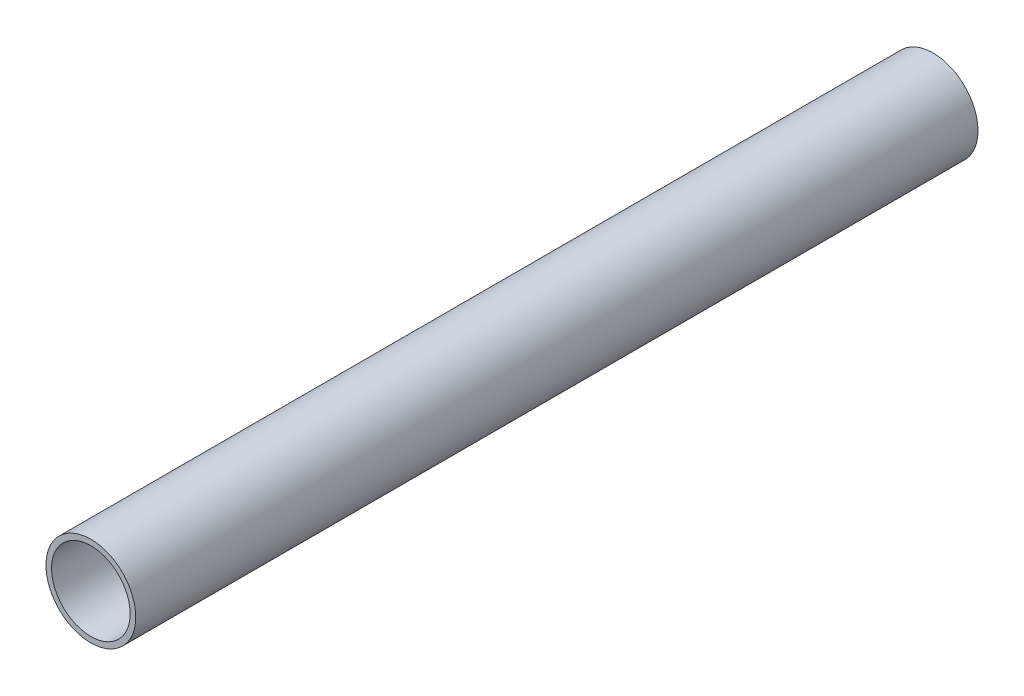
ISO-10303-21;
HEADER;
FILE_DESCRIPTION(('STEP AP214'),'2;1');
FILE_NAME('part.step','',(''),(''),'','','');
FILE_SCHEMA(('AUTOMOTIVE_DESIGN { 1 0 10303 214 1 1 1 1 }'));
ENDSEC;
DATA;
#1=APPLICATION_CONTEXT('core data for automotive mechanical design processes');
#2=APPLICATION_PROTOCOL_DEFINITION('international standard','automotive_design',2000,#1);
#3=PRODUCT_CONTEXT('',#1,'mechanical');
#4=PRODUCT('Part','Part','',(#3));
#5=PRODUCT_RELATED_PRODUCT_CATEGORY('part','',(#4));
#6=PRODUCT_DEFINITION_FORMATION('','',#4);
#7=PRODUCT_DEFINITION_CONTEXT('part definition',#1,'design');
#8=PRODUCT_DEFINITION('design','',#6,#7);
#9=PRODUCT_DEFINITION_SHAPE('','',#8);
#10=(LENGTH_UNIT() NAMED_UNIT(*) SI_UNIT(.MILLI.,.METRE.));
#11=(NAMED_UNIT(*) PLANE_ANGLE_UNIT() SI_UNIT($,.RADIAN.));
#12=(NAMED_UNIT(*) SI_UNIT($,.STERADIAN.) SOLID_ANGLE_UNIT());
#13=UNCERTAINTY_MEASURE_WITH_UNIT(LENGTH_MEASURE(1.E-05),#10,'distance_accuracy_value','');
#14=(GEOMETRIC_REPRESENTATION_CONTEXT(3) GLOBAL_UNCERTAINTY_ASSIGNED_CONTEXT((#13)) GLOBAL_UNIT_ASSIGNED_CONTEXT((#10,
#11,#12)) REPRESENTATION_CONTEXT('',''));
#15=CARTESIAN_POINT('',(0.,0.,0.));
#16=DIRECTION('',(0.,0.,1.));
#17=DIRECTION('',(1.,0.,0.));
#18=AXIS2_PLACEMENT_3D('',#15,#16,#17);
#19=CARTESIAN_POINT('',(0.,0.,150.));
#20=DIRECTION('',(0.,0.,1.));
#21=DIRECTION('',(1.,0.,0.));
#22=AXIS2_PLACEMENT_3D('',#19,#20,#21);
#23=PLANE('',#22);
#24=CARTESIAN_POINT('',(0.,0.,150.));
#25=DIRECTION('',(0.,0.,1.));
#26=DIRECTION('',(1.,0.,0.));
#27=AXIS2_PLACEMENT_3D('',#24,#25,#26);
#28=CIRCLE('',#27,8.);
#29=CARTESIAN_POINT('',(8.,0.,150.));
#30=VERTEX_POINT('',#29);
#31=EDGE_CURVE('E10',#30,#30,#28,.T.);
#32=ORIENTED_EDGE('',*,*,#31,.T.);
#33=EDGE_LOOP('',(#32));
#34=FACE_BOUND('',#33,.T.);
#35=CARTESIAN_POINT('',(0.,0.,150.));
#36=DIRECTION('',(0.,0.,1.));
#37=DIRECTION('',(1.,0.,0.));
#38=AXIS2_PLACEMENT_3D('',#35,#36,#37);
#39=CIRCLE('',#38,7.);
#40=CARTESIAN_POINT('',(7.,0.,150.));
#41=VERTEX_POINT('',#40);
#42=EDGE_CURVE('E50',#41,#41,#39,.T.);
#43=ORIENTED_EDGE('',*,*,#42,.F.);
#44=EDGE_LOOP('',(#43));
#45=FACE_BOUND('',#44,.T.);
#46=ADVANCED_FACE('F37',(#34,#45),#23,.T.);
#47=CARTESIAN_POINT('',(0.,0.,0.));
#48=DIRECTION('',(0.,0.,1.));
#49=DIRECTION('',(1.,0.,0.));
#50=AXIS2_PLACEMENT_3D('',#47,#48,#49);
#51=PLANE('',#50);
#52=CARTESIAN_POINT('',(0.,0.,0.));
#53=DIRECTION('',(0.,0.,1.));
#54=DIRECTION('',(1.,0.,0.));
#55=AXIS2_PLACEMENT_3D('',#52,#53,#54);
#56=CIRCLE('',#55,8.);
#57=CARTESIAN_POINT('',(8.,0.,0.));
#58=VERTEX_POINT('',#57);
#59=EDGE_CURVE('E41',#58,#58,#56,.T.);
#60=ORIENTED_EDGE('',*,*,#59,.F.);
#61=EDGE_LOOP('',(#60));
#62=FACE_BOUND('',#61,.T.);
#63=CARTESIAN_POINT('',(0.,0.,0.));
#64=DIRECTION('',(0.,0.,1.));
#65=DIRECTION('',(1.,0.,0.));
#66=AXIS2_PLACEMENT_3D('',#63,#64,#65);
#67=CIRCLE('',#66,7.);
#68=CARTESIAN_POINT('',(7.,0.,0.));
#69=VERTEX_POINT('',#68);
#70=EDGE_CURVE('E52',#69,#69,#67,.T.);
#71=ORIENTED_EDGE('',*,*,#70,.T.);
#72=EDGE_LOOP('',(#71));
#73=FACE_BOUND('',#72,.T.);
#74=ADVANCED_FACE('F64',(#62,#73),#51,.F.);
#75=CARTESIAN_POINT('',(0.,0.,150.));
#76=DIRECTION('',(0.,0.,-1.));
#77=DIRECTION('',(-1.,0.,0.));
#78=AXIS2_PLACEMENT_3D('',#75,#76,#77);
#79=CYLINDRICAL_SURFACE('',#78,8.);
#80=ORIENTED_EDGE('',*,*,#31,.F.);
#81=EDGE_LOOP('',(#80));
#82=FACE_BOUND('',#81,.T.);
#83=ORIENTED_EDGE('',*,*,#59,.T.);
#84=EDGE_LOOP('',(#83));
#85=FACE_BOUND('',#84,.T.);
#86=ADVANCED_FACE('F39',(#82,#85),#79,.T.);
#87=CARTESIAN_POINT('',(0.,0.,150.));
#88=DIRECTION('',(0.,0.,-1.));
#89=DIRECTION('',(-1.,0.,0.));
#90=AXIS2_PLACEMENT_3D('',#87,#88,#89);
#91=CYLINDRICAL_SURFACE('',#90,7.);
#92=ORIENTED_EDGE('',*,*,#42,.T.);
#93=EDGE_LOOP('',(#92));
#94=FACE_BOUND('',#93,.T.);
#95=ORIENTED_EDGE('',*,*,#70,.F.);
#96=EDGE_LOOP('',(#95));
#97=FACE_BOUND('',#96,.T.);
#98=ADVANCED_FACE('F60',(#94,#97),#91,.F.);
#99=CLOSED_SHELL('',(#46,#74,#86,#98));
#100=MANIFOLD_SOLID_BREP('B2',#99);
#101=ADVANCED_BREP_SHAPE_REPRESENTATION('',(#18,#100),#14);
#102=SHAPE_DEFINITION_REPRESENTATION(#9,#101);
ENDSEC;
END-ISO-10303-21;
